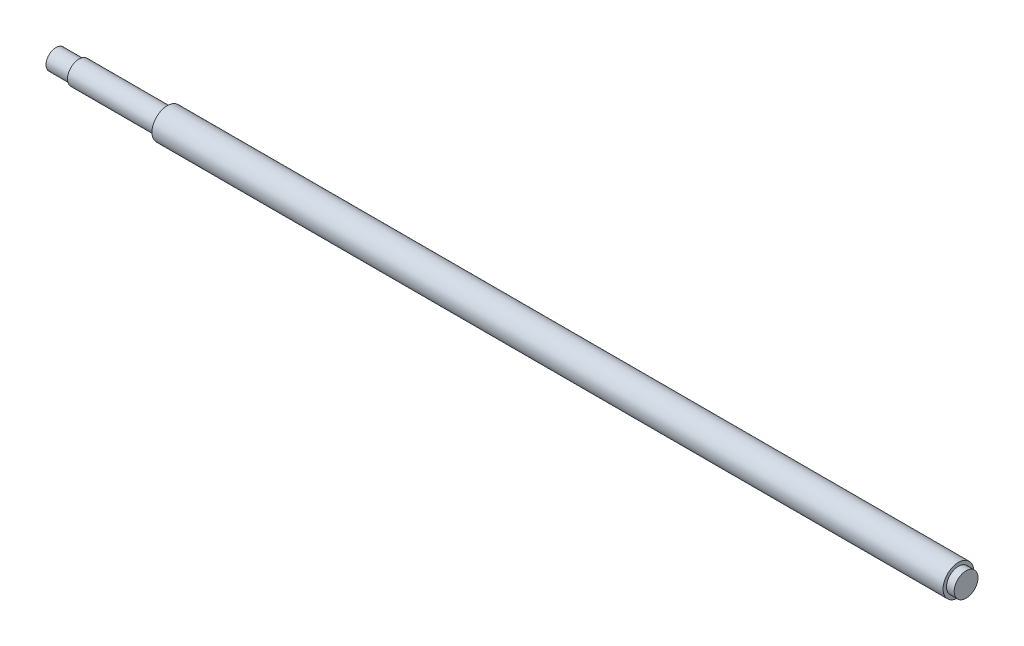
ISO-10303-21;
HEADER;
FILE_DESCRIPTION(('STEP AP214'),'2;1');
FILE_NAME('part.step','',(''),(''),'','','');
FILE_SCHEMA(('AUTOMOTIVE_DESIGN { 1 0 10303 214 1 1 1 1 }'));
ENDSEC;
DATA;
#1=APPLICATION_CONTEXT('core data for automotive mechanical design processes');
#2=APPLICATION_PROTOCOL_DEFINITION('international standard','automotive_design',2000,#1);
#3=PRODUCT_CONTEXT('',#1,'mechanical');
#4=PRODUCT('Part','Part','',(#3));
#5=PRODUCT_RELATED_PRODUCT_CATEGORY('part','',(#4));
#6=PRODUCT_DEFINITION_FORMATION('','',#4);
#7=PRODUCT_DEFINITION_CONTEXT('part definition',#1,'design');
#8=PRODUCT_DEFINITION('design','',#6,#7);
#9=PRODUCT_DEFINITION_SHAPE('','',#8);
#10=(LENGTH_UNIT() NAMED_UNIT(*) SI_UNIT(.MILLI.,.METRE.));
#11=(NAMED_UNIT(*) PLANE_ANGLE_UNIT() SI_UNIT($,.RADIAN.));
#12=(NAMED_UNIT(*) SI_UNIT($,.STERADIAN.) SOLID_ANGLE_UNIT());
#13=UNCERTAINTY_MEASURE_WITH_UNIT(LENGTH_MEASURE(1.E-05),#10,'distance_accuracy_value','');
#14=(GEOMETRIC_REPRESENTATION_CONTEXT(3) GLOBAL_UNCERTAINTY_ASSIGNED_CONTEXT((#13)) GLOBAL_UNIT_ASSIGNED_CONTEXT((#10,
#11,#12)) REPRESENTATION_CONTEXT('',''));
#15=CARTESIAN_POINT('',(0.,0.,0.));
#16=DIRECTION('',(0.,0.,1.));
#17=DIRECTION('',(1.,0.,0.));
#18=AXIS2_PLACEMENT_3D('',#15,#16,#17);
#19=CARTESIAN_POINT('',(0.,0.,0.));
#20=DIRECTION('',(-1.,0.,0.));
#21=DIRECTION('',(0.,0.,-1.));
#22=AXIS2_PLACEMENT_3D('',#19,#20,#21);
#23=PLANE('',#22);
#24=CARTESIAN_POINT('',(0.,0.,0.));
#25=DIRECTION('',(1.,0.,0.));
#26=DIRECTION('',(0.,0.,-1.));
#27=AXIS2_PLACEMENT_3D('',#24,#25,#26);
#28=CIRCLE('',#27,13.);
#29=CARTESIAN_POINT('',(0.,0.,-13.));
#30=VERTEX_POINT('',#29);
#31=EDGE_CURVE('E69',#30,#30,#28,.T.);
#32=ORIENTED_EDGE('',*,*,#31,.F.);
#33=EDGE_LOOP('',(#32));
#34=FACE_BOUND('',#33,.T.);
#35=ADVANCED_FACE('F41',(#34),#23,.T.);
#36=CARTESIAN_POINT('',(1185.,0.,0.));
#37=DIRECTION('',(1.,0.,0.));
#38=DIRECTION('',(0.,0.,1.));
#39=AXIS2_PLACEMENT_3D('',#36,#37,#38);
#40=PLANE('',#39);
#41=CARTESIAN_POINT('',(1185.,0.,0.));
#42=DIRECTION('',(1.,0.,0.));
#43=DIRECTION('',(0.,0.,-1.));
#44=AXIS2_PLACEMENT_3D('',#41,#42,#43);
#45=CIRCLE('',#44,15.5);
#46=CARTESIAN_POINT('',(1185.,0.,-15.5));
#47=VERTEX_POINT('',#46);
#48=EDGE_CURVE('E10',#47,#47,#45,.T.);
#49=ORIENTED_EDGE('',*,*,#48,.T.);
#50=EDGE_LOOP('',(#49));
#51=FACE_BOUND('',#50,.T.);
#52=ADVANCED_FACE('F76',(#51),#40,.T.);
#53=CARTESIAN_POINT('',(20.7391304347813,0.,0.));
#54=DIRECTION('',(-1.,0.,0.));
#55=DIRECTION('',(0.,0.,-1.));
#56=AXIS2_PLACEMENT_3D('',#53,#54,#55);
#57=CYLINDRICAL_SURFACE('',#56,15.5);
#58=ORIENTED_EDGE('',*,*,#48,.F.);
#59=EDGE_LOOP('',(#58));
#60=FACE_BOUND('',#59,.T.);
#61=CARTESIAN_POINT('',(1175.,0.,0.));
#62=DIRECTION('',(1.,0.,0.));
#63=DIRECTION('',(0.,0.,-1.));
#64=AXIS2_PLACEMENT_3D('',#61,#62,#63);
#65=CIRCLE('',#64,15.5);
#66=CARTESIAN_POINT('',(1175.,0.,-15.5));
#67=VERTEX_POINT('',#66);
#68=EDGE_CURVE('E47',#67,#67,#65,.T.);
#69=ORIENTED_EDGE('',*,*,#68,.T.);
#70=EDGE_LOOP('',(#69));
#71=FACE_BOUND('',#70,.T.);
#72=ADVANCED_FACE('F80',(#60,#71),#57,.T.);
#73=CARTESIAN_POINT('',(1175.,0.,0.));
#74=DIRECTION('',(1.,0.,0.));
#75=DIRECTION('',(0.,0.,1.));
#76=AXIS2_PLACEMENT_3D('',#73,#74,#75);
#77=PLANE('',#76);
#78=ORIENTED_EDGE('',*,*,#68,.F.);
#79=EDGE_LOOP('',(#78));
#80=FACE_BOUND('',#79,.T.);
#81=CARTESIAN_POINT('',(1175.,0.,0.));
#82=DIRECTION('',(1.,0.,0.));
#83=DIRECTION('',(0.,0.,-1.));
#84=AXIS2_PLACEMENT_3D('',#81,#82,#83);
#85=CIRCLE('',#84,20.);
#86=CARTESIAN_POINT('',(1175.,0.,-20.));
#87=VERTEX_POINT('',#86);
#88=EDGE_CURVE('E51',#87,#87,#85,.T.);
#89=ORIENTED_EDGE('',*,*,#88,.T.);
#90=EDGE_LOOP('',(#89));
#91=FACE_BOUND('',#90,.T.);
#92=ADVANCED_FACE('F84',(#80,#91),#77,.T.);
#93=CARTESIAN_POINT('',(20.7391304347813,0.,0.));
#94=DIRECTION('',(-1.,0.,0.));
#95=DIRECTION('',(0.,0.,-1.));
#96=AXIS2_PLACEMENT_3D('',#93,#94,#95);
#97=CYLINDRICAL_SURFACE('',#96,20.);
#98=ORIENTED_EDGE('',*,*,#88,.F.);
#99=EDGE_LOOP('',(#98));
#100=FACE_BOUND('',#99,.T.);
#101=CARTESIAN_POINT('',(145.,0.,0.));
#102=DIRECTION('',(1.,0.,0.));
#103=DIRECTION('',(0.,0.,-1.));
#104=AXIS2_PLACEMENT_3D('',#101,#102,#103);
#105=CIRCLE('',#104,20.);
#106=CARTESIAN_POINT('',(145.,0.,-20.));
#107=VERTEX_POINT('',#106);
#108=EDGE_CURVE('E55',#107,#107,#105,.T.);
#109=ORIENTED_EDGE('',*,*,#108,.T.);
#110=EDGE_LOOP('',(#109));
#111=FACE_BOUND('',#110,.T.);
#112=ADVANCED_FACE('F90',(#100,#111),#97,.T.);
#113=CARTESIAN_POINT('',(145.,0.,0.));
#114=DIRECTION('',(-1.,0.,0.));
#115=DIRECTION('',(0.,0.,-1.));
#116=AXIS2_PLACEMENT_3D('',#113,#114,#115);
#117=PLANE('',#116);
#118=ORIENTED_EDGE('',*,*,#108,.F.);
#119=EDGE_LOOP('',(#118));
#120=FACE_BOUND('',#119,.T.);
#121=CARTESIAN_POINT('',(145.,0.,0.));
#122=DIRECTION('',(1.,0.,0.));
#123=DIRECTION('',(0.,0.,-1.));
#124=AXIS2_PLACEMENT_3D('',#121,#122,#123);
#125=CIRCLE('',#124,15.);
#126=CARTESIAN_POINT('',(145.,0.,-15.));
#127=VERTEX_POINT('',#126);
#128=EDGE_CURVE('E60',#127,#127,#125,.T.);
#129=ORIENTED_EDGE('',*,*,#128,.T.);
#130=EDGE_LOOP('',(#129));
#131=FACE_BOUND('',#130,.T.);
#132=ADVANCED_FACE('F94',(#120,#131),#117,.T.);
#133=CARTESIAN_POINT('',(20.7391304347813,0.,0.));
#134=DIRECTION('',(-1.,0.,0.));
#135=DIRECTION('',(0.,0.,-1.));
#136=AXIS2_PLACEMENT_3D('',#133,#134,#135);
#137=CYLINDRICAL_SURFACE('',#136,15.);
#138=ORIENTED_EDGE('',*,*,#128,.F.);
#139=EDGE_LOOP('',(#138));
#140=FACE_BOUND('',#139,.T.);
#141=CARTESIAN_POINT('',(30.,0.,0.));
#142=DIRECTION('',(1.,0.,0.));
#143=DIRECTION('',(0.,0.,-1.));
#144=AXIS2_PLACEMENT_3D('',#141,#142,#143);
#145=CIRCLE('',#144,15.);
#146=CARTESIAN_POINT('',(30.,0.,-15.));
#147=VERTEX_POINT('',#146);
#148=EDGE_CURVE('E63',#147,#147,#145,.T.);
#149=ORIENTED_EDGE('',*,*,#148,.T.);
#150=EDGE_LOOP('',(#149));
#151=FACE_BOUND('',#150,.T.);
#152=ADVANCED_FACE('F98',(#140,#151),#137,.T.);
#153=CARTESIAN_POINT('',(30.,0.,0.));
#154=DIRECTION('',(-1.,0.,0.));
#155=DIRECTION('',(0.,0.,-1.));
#156=AXIS2_PLACEMENT_3D('',#153,#154,#155);
#157=PLANE('',#156);
#158=ORIENTED_EDGE('',*,*,#148,.F.);
#159=EDGE_LOOP('',(#158));
#160=FACE_BOUND('',#159,.T.);
#161=CARTESIAN_POINT('',(30.,0.,0.));
#162=DIRECTION('',(1.,0.,0.));
#163=DIRECTION('',(0.,0.,-1.));
#164=AXIS2_PLACEMENT_3D('',#161,#162,#163);
#165=CIRCLE('',#164,13.);
#166=CARTESIAN_POINT('',(30.,0.,-13.));
#167=VERTEX_POINT('',#166);
#168=EDGE_CURVE('E66',#167,#167,#165,.T.);
#169=ORIENTED_EDGE('',*,*,#168,.T.);
#170=EDGE_LOOP('',(#169));
#171=FACE_BOUND('',#170,.T.);
#172=ADVANCED_FACE('F102',(#160,#171),#157,.T.);
#173=CARTESIAN_POINT('',(20.7391304347813,0.,0.));
#174=DIRECTION('',(-1.,0.,0.));
#175=DIRECTION('',(0.,0.,-1.));
#176=AXIS2_PLACEMENT_3D('',#173,#174,#175);
#177=CYLINDRICAL_SURFACE('',#176,13.);
#178=ORIENTED_EDGE('',*,*,#168,.F.);
#179=EDGE_LOOP('',(#178));
#180=FACE_BOUND('',#179,.T.);
#181=ORIENTED_EDGE('',*,*,#31,.T.);
#182=EDGE_LOOP('',(#181));
#183=FACE_BOUND('',#182,.T.);
#184=ADVANCED_FACE('F73',(#180,#183),#177,.T.);
#185=CLOSED_SHELL('',(#35,#52,#72,#92,#112,#132,#152,#172,#184));
#186=MANIFOLD_SOLID_BREP('B2',#185);
#187=ADVANCED_BREP_SHAPE_REPRESENTATION('',(#18,#186),#14);
#188=SHAPE_DEFINITION_REPRESENTATION(#9,#187);
ENDSEC;
END-ISO-10303-21;
